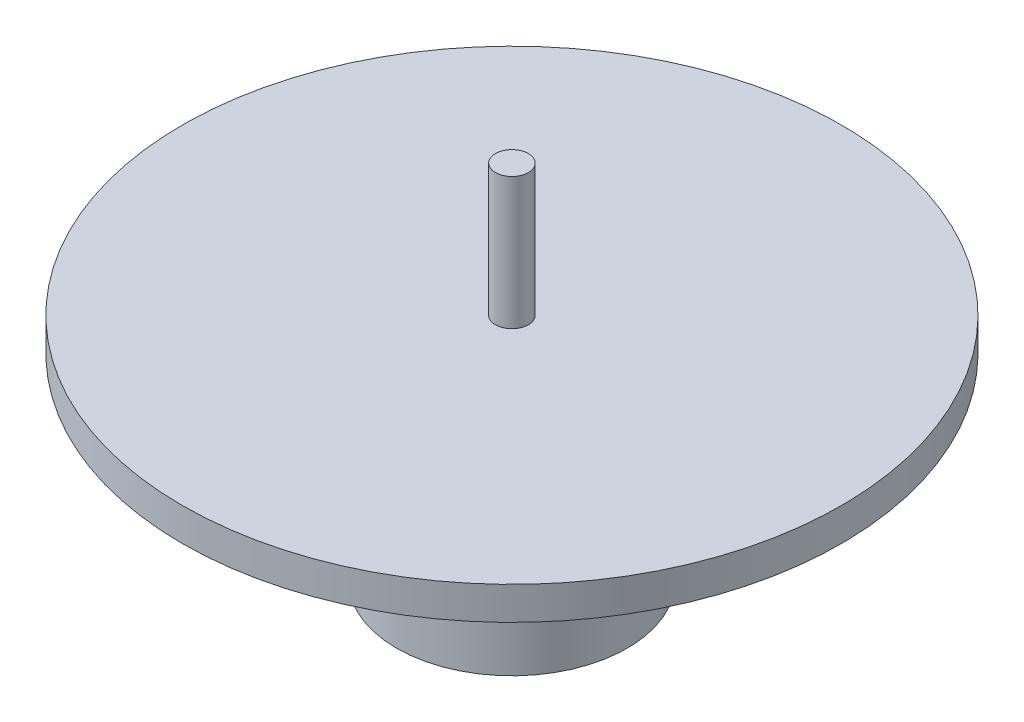
ISO-10303-21;
HEADER;
FILE_DESCRIPTION(('STEP AP214'),'2;1');
FILE_NAME('part.step','',(''),(''),'','','');
FILE_SCHEMA(('AUTOMOTIVE_DESIGN { 1 0 10303 214 1 1 1 1 }'));
ENDSEC;
DATA;
#1=APPLICATION_CONTEXT('core data for automotive mechanical design processes');
#2=APPLICATION_PROTOCOL_DEFINITION('international standard','automotive_design',2000,#1);
#3=PRODUCT_CONTEXT('',#1,'mechanical');
#4=PRODUCT('Part','Part','',(#3));
#5=PRODUCT_RELATED_PRODUCT_CATEGORY('part','',(#4));
#6=PRODUCT_DEFINITION_FORMATION('','',#4);
#7=PRODUCT_DEFINITION_CONTEXT('part definition',#1,'design');
#8=PRODUCT_DEFINITION('design','',#6,#7);
#9=PRODUCT_DEFINITION_SHAPE('','',#8);
#10=(LENGTH_UNIT() NAMED_UNIT(*) SI_UNIT(.MILLI.,.METRE.));
#11=(NAMED_UNIT(*) PLANE_ANGLE_UNIT() SI_UNIT($,.RADIAN.));
#12=(NAMED_UNIT(*) SI_UNIT($,.STERADIAN.) SOLID_ANGLE_UNIT());
#13=UNCERTAINTY_MEASURE_WITH_UNIT(LENGTH_MEASURE(1.E-05),#10,'distance_accuracy_value','');
#14=(GEOMETRIC_REPRESENTATION_CONTEXT(3) GLOBAL_UNCERTAINTY_ASSIGNED_CONTEXT((#13)) GLOBAL_UNIT_ASSIGNED_CONTEXT((#10,
#11,#12)) REPRESENTATION_CONTEXT('',''));
#15=CARTESIAN_POINT('',(0.,0.,0.));
#16=DIRECTION('',(0.,0.,1.));
#17=DIRECTION('',(1.,0.,0.));
#18=AXIS2_PLACEMENT_3D('',#15,#16,#17);
#19=CARTESIAN_POINT('',(0.,5.,0.));
#20=DIRECTION('',(0.,-1.,0.));
#21=DIRECTION('',(0.,0.,-1.));
#22=AXIS2_PLACEMENT_3D('',#19,#20,#21);
#23=CYLINDRICAL_SURFACE('',#22,3.5);
#24=CARTESIAN_POINT('',(0.,5.,0.));
#25=DIRECTION('',(0.,1.,0.));
#26=DIRECTION('',(0.,0.,1.));
#27=AXIS2_PLACEMENT_3D('',#24,#25,#26);
#28=CIRCLE('',#27,3.5);
#29=CARTESIAN_POINT('',(0.,5.,3.5));
#30=VERTEX_POINT('',#29);
#31=EDGE_CURVE('E10',#30,#30,#28,.T.);
#32=ORIENTED_EDGE('',*,*,#31,.F.);
#33=EDGE_LOOP('',(#32));
#34=FACE_BOUND('',#33,.T.);
#35=CARTESIAN_POINT('',(0.,0.,0.));
#36=DIRECTION('',(0.,1.,0.));
#37=DIRECTION('',(0.,0.,1.));
#38=AXIS2_PLACEMENT_3D('',#35,#36,#37);
#39=CIRCLE('',#38,3.5);
#40=CARTESIAN_POINT('',(0.,0.,3.5));
#41=VERTEX_POINT('',#40);
#42=EDGE_CURVE('E38',#41,#41,#39,.T.);
#43=ORIENTED_EDGE('',*,*,#42,.T.);
#44=EDGE_LOOP('',(#43));
#45=FACE_BOUND('',#44,.T.);
#46=ADVANCED_FACE('F35',(#34,#45),#23,.T.);
#47=CARTESIAN_POINT('',(0.,0.,0.));
#48=DIRECTION('',(0.,1.,0.));
#49=DIRECTION('',(0.,0.,1.));
#50=AXIS2_PLACEMENT_3D('',#47,#48,#49);
#51=PLANE('',#50);
#52=ORIENTED_EDGE('',*,*,#42,.F.);
#53=EDGE_LOOP('',(#52));
#54=FACE_BOUND('',#53,.T.);
#55=ADVANCED_FACE('F93',(#54),#51,.F.);
#56=CARTESIAN_POINT('',(0.,6.,0.));
#57=DIRECTION('',(0.,-1.,0.));
#58=DIRECTION('',(0.,0.,-1.));
#59=AXIS2_PLACEMENT_3D('',#56,#57,#58);
#60=CYLINDRICAL_SURFACE('',#59,5.5);
#61=CARTESIAN_POINT('',(0.,6.,0.));
#62=DIRECTION('',(0.,1.,0.));
#63=DIRECTION('',(0.,0.,1.));
#64=AXIS2_PLACEMENT_3D('',#61,#62,#63);
#65=CIRCLE('',#64,5.5);
#66=CARTESIAN_POINT('',(0.,6.,5.5));
#67=VERTEX_POINT('',#66);
#68=EDGE_CURVE('E45',#67,#67,#65,.T.);
#69=ORIENTED_EDGE('',*,*,#68,.F.);
#70=EDGE_LOOP('',(#69));
#71=FACE_BOUND('',#70,.T.);
#72=CARTESIAN_POINT('',(0.,5.,0.));
#73=DIRECTION('',(0.,1.,0.));
#74=DIRECTION('',(0.,0.,1.));
#75=AXIS2_PLACEMENT_3D('',#72,#73,#74);
#76=CIRCLE('',#75,5.5);
#77=CARTESIAN_POINT('',(0.,5.,5.5));
#78=VERTEX_POINT('',#77);
#79=EDGE_CURVE('E47',#78,#78,#76,.T.);
#80=ORIENTED_EDGE('',*,*,#79,.T.);
#81=EDGE_LOOP('',(#80));
#82=FACE_BOUND('',#81,.T.);
#83=ADVANCED_FACE('F98',(#71,#82),#60,.T.);
#84=CARTESIAN_POINT('',(0.,5.,0.));
#85=DIRECTION('',(0.,1.,0.));
#86=DIRECTION('',(0.,0.,1.));
#87=AXIS2_PLACEMENT_3D('',#84,#85,#86);
#88=PLANE('',#87);
#89=ORIENTED_EDGE('',*,*,#31,.T.);
#90=EDGE_LOOP('',(#89));
#91=FACE_BOUND('',#90,.T.);
#92=ORIENTED_EDGE('',*,*,#79,.F.);
#93=EDGE_LOOP('',(#92));
#94=FACE_BOUND('',#93,.T.);
#95=ADVANCED_FACE('F83',(#91,#94),#88,.F.);
#96=CARTESIAN_POINT('',(0.,7.,0.));
#97=DIRECTION('',(0.,-1.,0.));
#98=DIRECTION('',(0.,0.,-1.));
#99=AXIS2_PLACEMENT_3D('',#96,#97,#98);
#100=CYLINDRICAL_SURFACE('',#99,10.);
#101=CARTESIAN_POINT('',(0.,7.,0.));
#102=DIRECTION('',(0.,1.,0.));
#103=DIRECTION('',(0.,0.,1.));
#104=AXIS2_PLACEMENT_3D('',#101,#102,#103);
#105=CIRCLE('',#104,10.);
#106=CARTESIAN_POINT('',(0.,7.,10.));
#107=VERTEX_POINT('',#106);
#108=EDGE_CURVE('E50',#107,#107,#105,.T.);
#109=ORIENTED_EDGE('',*,*,#108,.F.);
#110=EDGE_LOOP('',(#109));
#111=FACE_BOUND('',#110,.T.);
#112=CARTESIAN_POINT('',(0.,6.,0.));
#113=DIRECTION('',(0.,1.,0.));
#114=DIRECTION('',(0.,0.,1.));
#115=AXIS2_PLACEMENT_3D('',#112,#113,#114);
#116=CIRCLE('',#115,10.);
#117=CARTESIAN_POINT('',(0.,6.,10.));
#118=VERTEX_POINT('',#117);
#119=EDGE_CURVE('E53',#118,#118,#116,.T.);
#120=ORIENTED_EDGE('',*,*,#119,.T.);
#121=EDGE_LOOP('',(#120));
#122=FACE_BOUND('',#121,.T.);
#123=ADVANCED_FACE('F77',(#111,#122),#100,.T.);
#124=CARTESIAN_POINT('',(0.,7.,0.));
#125=DIRECTION('',(0.,1.,0.));
#126=DIRECTION('',(0.,0.,1.));
#127=AXIS2_PLACEMENT_3D('',#124,#125,#126);
#128=PLANE('',#127);
#129=CARTESIAN_POINT('',(0.,7.,0.));
#130=DIRECTION('',(0.,1.,0.));
#131=DIRECTION('',(0.,0.,1.));
#132=AXIS2_PLACEMENT_3D('',#129,#130,#131);
#133=CIRCLE('',#132,0.5);
#134=CARTESIAN_POINT('',(0.,7.,0.5));
#135=VERTEX_POINT('',#134);
#136=EDGE_CURVE('E59',#135,#135,#133,.T.);
#137=ORIENTED_EDGE('',*,*,#136,.F.);
#138=EDGE_LOOP('',(#137));
#139=FACE_BOUND('',#138,.T.);
#140=ORIENTED_EDGE('',*,*,#108,.T.);
#141=EDGE_LOOP('',(#140));
#142=FACE_BOUND('',#141,.T.);
#143=ADVANCED_FACE('F74',(#139,#142),#128,.T.);
#144=CARTESIAN_POINT('',(0.,6.,0.));
#145=DIRECTION('',(0.,1.,0.));
#146=DIRECTION('',(0.,0.,1.));
#147=AXIS2_PLACEMENT_3D('',#144,#145,#146);
#148=PLANE('',#147);
#149=ORIENTED_EDGE('',*,*,#68,.T.);
#150=EDGE_LOOP('',(#149));
#151=FACE_BOUND('',#150,.T.);
#152=ORIENTED_EDGE('',*,*,#119,.F.);
#153=EDGE_LOOP('',(#152));
#154=FACE_BOUND('',#153,.T.);
#155=ADVANCED_FACE('F70',(#151,#154),#148,.F.);
#156=CARTESIAN_POINT('',(0.,11.,0.));
#157=DIRECTION('',(0.,-1.,0.));
#158=DIRECTION('',(0.,0.,-1.));
#159=AXIS2_PLACEMENT_3D('',#156,#157,#158);
#160=CYLINDRICAL_SURFACE('',#159,0.5);
#161=CARTESIAN_POINT('',(0.,11.,0.));
#162=DIRECTION('',(0.,1.,0.));
#163=DIRECTION('',(0.,0.,1.));
#164=AXIS2_PLACEMENT_3D('',#161,#162,#163);
#165=CIRCLE('',#164,0.5);
#166=CARTESIAN_POINT('',(0.,11.,0.5));
#167=VERTEX_POINT('',#166);
#168=EDGE_CURVE('E56',#167,#167,#165,.T.);
#169=ORIENTED_EDGE('',*,*,#168,.F.);
#170=EDGE_LOOP('',(#169));
#171=FACE_BOUND('',#170,.T.);
#172=ORIENTED_EDGE('',*,*,#136,.T.);
#173=EDGE_LOOP('',(#172));
#174=FACE_BOUND('',#173,.T.);
#175=ADVANCED_FACE('F67',(#171,#174),#160,.T.);
#176=CARTESIAN_POINT('',(0.,11.,0.));
#177=DIRECTION('',(0.,1.,0.));
#178=DIRECTION('',(0.,0.,1.));
#179=AXIS2_PLACEMENT_3D('',#176,#177,#178);
#180=PLANE('',#179);
#181=ORIENTED_EDGE('',*,*,#168,.T.);
#182=EDGE_LOOP('',(#181));
#183=FACE_BOUND('',#182,.T.);
#184=ADVANCED_FACE('F65',(#183),#180,.T.);
#185=CLOSED_SHELL('',(#46,#55,#83,#95,#123,#143,#155,#175,#184));
#186=MANIFOLD_SOLID_BREP('B2',#185);
#187=ADVANCED_BREP_SHAPE_REPRESENTATION('',(#18,#186),#14);
#188=SHAPE_DEFINITION_REPRESENTATION(#9,#187);
ENDSEC;
END-ISO-10303-21;
